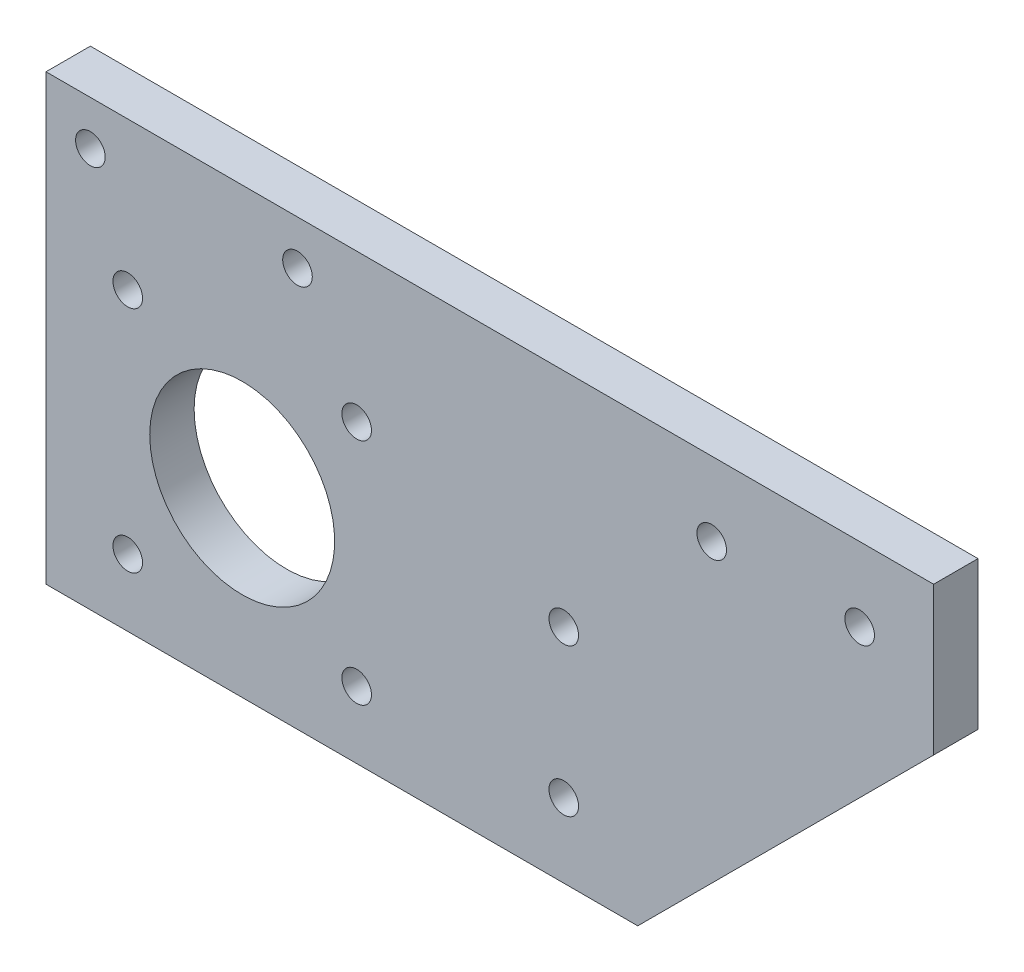
ISO-10303-21;
HEADER;
FILE_DESCRIPTION(('STEP AP214'),'2;1');
FILE_NAME('part.step','',(''),(''),'','','');
FILE_SCHEMA(('AUTOMOTIVE_DESIGN { 1 0 10303 214 1 1 1 1 }'));
ENDSEC;
DATA;
#1=APPLICATION_CONTEXT('core data for automotive mechanical design processes');
#2=APPLICATION_PROTOCOL_DEFINITION('international standard','automotive_design',2000,#1);
#3=PRODUCT_CONTEXT('',#1,'mechanical');
#4=PRODUCT('Part','Part','',(#3));
#5=PRODUCT_RELATED_PRODUCT_CATEGORY('part','',(#4));
#6=PRODUCT_DEFINITION_FORMATION('','',#4);
#7=PRODUCT_DEFINITION_CONTEXT('part definition',#1,'design');
#8=PRODUCT_DEFINITION('design','',#6,#7);
#9=PRODUCT_DEFINITION_SHAPE('','',#8);
#10=(LENGTH_UNIT() NAMED_UNIT(*) SI_UNIT(.MILLI.,.METRE.));
#11=(NAMED_UNIT(*) PLANE_ANGLE_UNIT() SI_UNIT($,.RADIAN.));
#12=(NAMED_UNIT(*) SI_UNIT($,.STERADIAN.) SOLID_ANGLE_UNIT());
#13=UNCERTAINTY_MEASURE_WITH_UNIT(LENGTH_MEASURE(1.E-05),#10,'distance_accuracy_value','');
#14=(GEOMETRIC_REPRESENTATION_CONTEXT(3) GLOBAL_UNCERTAINTY_ASSIGNED_CONTEXT((#13)) GLOBAL_UNIT_ASSIGNED_CONTEXT((#10,
#11,#12)) REPRESENTATION_CONTEXT('',''));
#15=CARTESIAN_POINT('',(0.,0.,0.));
#16=DIRECTION('',(0.,0.,1.));
#17=DIRECTION('',(1.,0.,0.));
#18=AXIS2_PLACEMENT_3D('',#15,#16,#17);
#19=CARTESIAN_POINT('',(0.,0.,6.));
#20=DIRECTION('',(0.,0.,-1.));
#21=DIRECTION('',(-1.,0.,0.));
#22=AXIS2_PLACEMENT_3D('',#19,#20,#21);
#23=PLANE('',#22);
#24=CARTESIAN_POINT('',(-17.9999999999997,-50.95,6.));
#25=DIRECTION('',(0.,0.,-1.));
#26=DIRECTION('',(-1.,0.,0.));
#27=AXIS2_PLACEMENT_3D('',#24,#25,#26);
#28=CIRCLE('',#27,2.00000000000348);
#29=CARTESIAN_POINT('',(-20.0000000000032,-50.95,6.));
#30=VERTEX_POINT('',#29);
#31=EDGE_CURVE('E195',#30,#30,#28,.T.);
#32=ORIENTED_EDGE('',*,*,#31,.T.);
#33=EDGE_LOOP('',(#32));
#34=FACE_BOUND('',#33,.T.);
#35=CARTESIAN_POINT('',(-48.9499999999997,-20.,6.));
#36=DIRECTION('',(0.,0.,-1.));
#37=DIRECTION('',(-1.,0.,0.));
#38=AXIS2_PLACEMENT_3D('',#35,#36,#37);
#39=CIRCLE('',#38,2.00000000000348);
#40=CARTESIAN_POINT('',(-50.9500000000032,-20.,6.));
#41=VERTEX_POINT('',#40);
#42=EDGE_CURVE('E202',#41,#41,#39,.T.);
#43=ORIENTED_EDGE('',*,*,#42,.T.);
#44=EDGE_LOOP('',(#43));
#45=FACE_BOUND('',#44,.T.);
#46=CARTESIAN_POINT('',(-48.9499999999997,-50.95,6.));
#47=DIRECTION('',(0.,0.,-1.));
#48=DIRECTION('',(-1.,0.,0.));
#49=AXIS2_PLACEMENT_3D('',#46,#47,#48);
#50=CIRCLE('',#49,2.00000000000348);
#51=CARTESIAN_POINT('',(-50.9500000000032,-50.95,6.));
#52=VERTEX_POINT('',#51);
#53=EDGE_CURVE('E206',#52,#52,#50,.T.);
#54=ORIENTED_EDGE('',*,*,#53,.T.);
#55=EDGE_LOOP('',(#54));
#56=FACE_BOUND('',#55,.T.);
#57=CARTESIAN_POINT('',(-33.4749999999997,-35.475,6.));
#58=DIRECTION('',(0.,0.,-1.));
#59=DIRECTION('',(-1.,0.,0.));
#60=AXIS2_PLACEMENT_3D('',#57,#58,#59);
#61=CIRCLE('',#60,12.5000000000035);
#62=CARTESIAN_POINT('',(-45.9750000000032,-35.475,6.));
#63=VERTEX_POINT('',#62);
#64=EDGE_CURVE('E210',#63,#63,#61,.T.);
#65=ORIENTED_EDGE('',*,*,#64,.T.);
#66=EDGE_LOOP('',(#65));
#67=FACE_BOUND('',#66,.T.);
#68=CARTESIAN_POINT('',(-17.9999999999997,-20.,6.));
#69=DIRECTION('',(0.,0.,-1.));
#70=DIRECTION('',(-1.,0.,0.));
#71=AXIS2_PLACEMENT_3D('',#68,#69,#70);
#72=CIRCLE('',#71,2.00000000000348);
#73=CARTESIAN_POINT('',(-20.0000000000032,-20.,6.));
#74=VERTEX_POINT('',#73);
#75=EDGE_CURVE('E214',#74,#74,#72,.T.);
#76=ORIENTED_EDGE('',*,*,#75,.T.);
#77=EDGE_LOOP('',(#76));
#78=FACE_BOUND('',#77,.T.);
#79=DIRECTION('',(-1.,0.,0.));
#80=VECTOR('',#79,1.);
#81=CARTESIAN_POINT('',(-60.,0.,6.));
#82=LINE('',#81,#80);
#83=CARTESIAN_POINT('',(60.,0.,6.));
#84=VERTEX_POINT('',#83);
#85=CARTESIAN_POINT('',(-60.,0.,6.));
#86=VERTEX_POINT('',#85);
#87=EDGE_CURVE('E57',#84,#86,#82,.T.);
#88=ORIENTED_EDGE('',*,*,#87,.T.);
#89=DIRECTION('',(0.,-1.,0.));
#90=VECTOR('',#89,1.);
#91=CARTESIAN_POINT('',(-60.,-60.,6.));
#92=LINE('',#91,#90);
#93=CARTESIAN_POINT('',(-60.,-60.,6.));
#94=VERTEX_POINT('',#93);
#95=EDGE_CURVE('E92',#86,#94,#92,.T.);
#96=ORIENTED_EDGE('',*,*,#95,.T.);
#97=DIRECTION('',(1.,0.,0.));
#98=VECTOR('',#97,1.);
#99=CARTESIAN_POINT('',(-60.,-60.,6.));
#100=LINE('',#99,#98);
#101=CARTESIAN_POINT('',(20.,-60.,6.));
#102=VERTEX_POINT('',#101);
#103=EDGE_CURVE('E97',#94,#102,#100,.T.);
#104=ORIENTED_EDGE('',*,*,#103,.T.);
#105=DIRECTION('',(0.707106781186548,0.707106781186548,0.));
#106=VECTOR('',#105,1.);
#107=CARTESIAN_POINT('',(20.,-60.,6.));
#108=LINE('',#107,#106);
#109=CARTESIAN_POINT('',(60.,-20.,6.));
#110=VERTEX_POINT('',#109);
#111=EDGE_CURVE('E101',#102,#110,#108,.T.);
#112=ORIENTED_EDGE('',*,*,#111,.T.);
#113=DIRECTION('',(0.,1.,0.));
#114=VECTOR('',#113,1.);
#115=CARTESIAN_POINT('',(60.,0.,6.));
#116=LINE('',#115,#114);
#117=EDGE_CURVE('E115',#110,#84,#116,.T.);
#118=ORIENTED_EDGE('',*,*,#117,.T.);
#119=EDGE_LOOP('',(#88,#96,#104,#112,#118));
#120=FACE_BOUND('',#119,.T.);
#121=CARTESIAN_POINT('',(50.,-10.,6.));
#122=DIRECTION('',(0.,0.,1.));
#123=DIRECTION('',(1.,0.,0.));
#124=AXIS2_PLACEMENT_3D('',#121,#122,#123);
#125=CIRCLE('',#124,2.);
#126=CARTESIAN_POINT('',(52.,-10.,6.));
#127=VERTEX_POINT('',#126);
#128=EDGE_CURVE('E126',#127,#127,#125,.T.);
#129=ORIENTED_EDGE('',*,*,#128,.F.);
#130=EDGE_LOOP('',(#129));
#131=FACE_BOUND('',#130,.T.);
#132=CARTESIAN_POINT('',(30.,-10.,6.));
#133=DIRECTION('',(0.,0.,1.));
#134=DIRECTION('',(1.,0.,0.));
#135=AXIS2_PLACEMENT_3D('',#132,#133,#134);
#136=CIRCLE('',#135,2.);
#137=CARTESIAN_POINT('',(32.,-10.,6.));
#138=VERTEX_POINT('',#137);
#139=EDGE_CURVE('E155',#138,#138,#136,.T.);
#140=ORIENTED_EDGE('',*,*,#139,.F.);
#141=EDGE_LOOP('',(#140));
#142=FACE_BOUND('',#141,.T.);
#143=CARTESIAN_POINT('',(10.,-50.,6.));
#144=DIRECTION('',(0.,0.,1.));
#145=DIRECTION('',(1.,0.,0.));
#146=AXIS2_PLACEMENT_3D('',#143,#144,#145);
#147=CIRCLE('',#146,2.);
#148=CARTESIAN_POINT('',(12.,-50.,6.));
#149=VERTEX_POINT('',#148);
#150=EDGE_CURVE('E163',#149,#149,#147,.T.);
#151=ORIENTED_EDGE('',*,*,#150,.F.);
#152=EDGE_LOOP('',(#151));
#153=FACE_BOUND('',#152,.T.);
#154=CARTESIAN_POINT('',(10.,-30.,6.));
#155=DIRECTION('',(0.,0.,1.));
#156=DIRECTION('',(1.,0.,0.));
#157=AXIS2_PLACEMENT_3D('',#154,#155,#156);
#158=CIRCLE('',#157,2.);
#159=CARTESIAN_POINT('',(12.,-30.,6.));
#160=VERTEX_POINT('',#159);
#161=EDGE_CURVE('E171',#160,#160,#158,.T.);
#162=ORIENTED_EDGE('',*,*,#161,.F.);
#163=EDGE_LOOP('',(#162));
#164=FACE_BOUND('',#163,.T.);
#165=CARTESIAN_POINT('',(-54.,-6.,6.));
#166=DIRECTION('',(0.,0.,1.));
#167=DIRECTION('',(1.,0.,0.));
#168=AXIS2_PLACEMENT_3D('',#165,#166,#167);
#169=CIRCLE('',#168,2.);
#170=CARTESIAN_POINT('',(-52.,-6.,6.));
#171=VERTEX_POINT('',#170);
#172=EDGE_CURVE('E179',#171,#171,#169,.T.);
#173=ORIENTED_EDGE('',*,*,#172,.F.);
#174=EDGE_LOOP('',(#173));
#175=FACE_BOUND('',#174,.T.);
#176=CARTESIAN_POINT('',(-26.,-6.,6.));
#177=DIRECTION('',(0.,0.,1.));
#178=DIRECTION('',(1.,0.,0.));
#179=AXIS2_PLACEMENT_3D('',#176,#177,#178);
#180=CIRCLE('',#179,2.);
#181=CARTESIAN_POINT('',(-24.,-6.,6.));
#182=VERTEX_POINT('',#181);
#183=EDGE_CURVE('E187',#182,#182,#180,.T.);
#184=ORIENTED_EDGE('',*,*,#183,.F.);
#185=EDGE_LOOP('',(#184));
#186=FACE_BOUND('',#185,.T.);
#187=ADVANCED_FACE('F39',(#34,#45,#56,#67,#78,#120,#131,#142,#153,#164,#175,#186),#23,.F.);
#188=CARTESIAN_POINT('',(0.,0.,0.));
#189=DIRECTION('',(0.,0.,-1.));
#190=DIRECTION('',(-1.,0.,0.));
#191=AXIS2_PLACEMENT_3D('',#188,#189,#190);
#192=PLANE('',#191);
#193=CARTESIAN_POINT('',(-17.9999999999997,-50.95,0.));
#194=DIRECTION('',(0.,0.,-1.));
#195=DIRECTION('',(-1.,0.,0.));
#196=AXIS2_PLACEMENT_3D('',#193,#194,#195);
#197=CIRCLE('',#196,2.00000000000348);
#198=CARTESIAN_POINT('',(-20.0000000000032,-50.95,0.));
#199=VERTEX_POINT('',#198);
#200=EDGE_CURVE('E222',#199,#199,#197,.T.);
#201=ORIENTED_EDGE('',*,*,#200,.F.);
#202=EDGE_LOOP('',(#201));
#203=FACE_BOUND('',#202,.T.);
#204=CARTESIAN_POINT('',(-48.9499999999997,-20.,0.));
#205=DIRECTION('',(0.,0.,-1.));
#206=DIRECTION('',(1.,0.,0.));
#207=AXIS2_PLACEMENT_3D('',#204,#205,#206);
#208=CIRCLE('',#207,2.00000000000348);
#209=CARTESIAN_POINT('',(-46.9499999999962,-20.,0.));
#210=VERTEX_POINT('',#209);
#211=EDGE_CURVE('E223',#210,#210,#208,.T.);
#212=ORIENTED_EDGE('',*,*,#211,.F.);
#213=EDGE_LOOP('',(#212));
#214=FACE_BOUND('',#213,.T.);
#215=CARTESIAN_POINT('',(-48.9499999999997,-50.95,0.));
#216=DIRECTION('',(0.,0.,-1.));
#217=DIRECTION('',(1.,0.,0.));
#218=AXIS2_PLACEMENT_3D('',#215,#216,#217);
#219=CIRCLE('',#218,2.00000000000348);
#220=CARTESIAN_POINT('',(-46.9499999999962,-50.95,0.));
#221=VERTEX_POINT('',#220);
#222=EDGE_CURVE('E227',#221,#221,#219,.T.);
#223=ORIENTED_EDGE('',*,*,#222,.F.);
#224=EDGE_LOOP('',(#223));
#225=FACE_BOUND('',#224,.T.);
#226=CARTESIAN_POINT('',(-33.4749999999997,-35.475,0.));
#227=DIRECTION('',(0.,0.,-1.));
#228=DIRECTION('',(-1.,0.,0.));
#229=AXIS2_PLACEMENT_3D('',#226,#227,#228);
#230=CIRCLE('',#229,12.5000000000035);
#231=CARTESIAN_POINT('',(-45.9750000000032,-35.475,0.));
#232=VERTEX_POINT('',#231);
#233=EDGE_CURVE('E231',#232,#232,#230,.T.);
#234=ORIENTED_EDGE('',*,*,#233,.F.);
#235=EDGE_LOOP('',(#234));
#236=FACE_BOUND('',#235,.T.);
#237=CARTESIAN_POINT('',(-17.9999999999997,-20.,0.));
#238=DIRECTION('',(0.,0.,-1.));
#239=DIRECTION('',(-1.,0.,0.));
#240=AXIS2_PLACEMENT_3D('',#237,#238,#239);
#241=CIRCLE('',#240,2.00000000000348);
#242=CARTESIAN_POINT('',(-20.0000000000032,-20.,0.));
#243=VERTEX_POINT('',#242);
#244=EDGE_CURVE('E218',#243,#243,#241,.T.);
#245=ORIENTED_EDGE('',*,*,#244,.F.);
#246=EDGE_LOOP('',(#245));
#247=FACE_BOUND('',#246,.T.);
#248=CARTESIAN_POINT('',(-54.,-6.,0.));
#249=DIRECTION('',(0.,0.,1.));
#250=DIRECTION('',(1.,0.,0.));
#251=AXIS2_PLACEMENT_3D('',#248,#249,#250);
#252=CIRCLE('',#251,2.);
#253=CARTESIAN_POINT('',(-52.,-6.,0.));
#254=VERTEX_POINT('',#253);
#255=EDGE_CURVE('E183',#254,#254,#252,.T.);
#256=ORIENTED_EDGE('',*,*,#255,.T.);
#257=EDGE_LOOP('',(#256));
#258=FACE_BOUND('',#257,.T.);
#259=CARTESIAN_POINT('',(10.,-50.,0.));
#260=DIRECTION('',(0.,0.,1.));
#261=DIRECTION('',(1.,0.,0.));
#262=AXIS2_PLACEMENT_3D('',#259,#260,#261);
#263=CIRCLE('',#262,2.);
#264=CARTESIAN_POINT('',(12.,-50.,0.));
#265=VERTEX_POINT('',#264);
#266=EDGE_CURVE('E167',#265,#265,#263,.T.);
#267=ORIENTED_EDGE('',*,*,#266,.T.);
#268=EDGE_LOOP('',(#267));
#269=FACE_BOUND('',#268,.T.);
#270=CARTESIAN_POINT('',(50.,-10.,0.));
#271=DIRECTION('',(0.,0.,1.));
#272=DIRECTION('',(1.,0.,0.));
#273=AXIS2_PLACEMENT_3D('',#270,#271,#272);
#274=CIRCLE('',#273,2.);
#275=CARTESIAN_POINT('',(52.,-10.,0.));
#276=VERTEX_POINT('',#275);
#277=EDGE_CURVE('E151',#276,#276,#274,.T.);
#278=ORIENTED_EDGE('',*,*,#277,.T.);
#279=EDGE_LOOP('',(#278));
#280=FACE_BOUND('',#279,.T.);
#281=DIRECTION('',(0.,-1.,0.));
#282=VECTOR('',#281,1.);
#283=CARTESIAN_POINT('',(-60.,-60.,0.));
#284=LINE('',#283,#282);
#285=CARTESIAN_POINT('',(-60.,0.,0.));
#286=VERTEX_POINT('',#285);
#287=CARTESIAN_POINT('',(-60.,-60.,0.));
#288=VERTEX_POINT('',#287);
#289=EDGE_CURVE('E122',#286,#288,#284,.T.);
#290=ORIENTED_EDGE('',*,*,#289,.F.);
#291=DIRECTION('',(-1.,0.,0.));
#292=VECTOR('',#291,1.);
#293=CARTESIAN_POINT('',(0.,0.,0.));
#294=LINE('',#293,#292);
#295=CARTESIAN_POINT('',(60.,0.,0.));
#296=VERTEX_POINT('',#295);
#297=EDGE_CURVE('E133',#296,#286,#294,.T.);
#298=ORIENTED_EDGE('',*,*,#297,.F.);
#299=DIRECTION('',(0.,1.,0.));
#300=VECTOR('',#299,1.);
#301=CARTESIAN_POINT('',(60.,0.,0.));
#302=LINE('',#301,#300);
#303=CARTESIAN_POINT('',(60.,-20.,0.));
#304=VERTEX_POINT('',#303);
#305=EDGE_CURVE('E85',#304,#296,#302,.T.);
#306=ORIENTED_EDGE('',*,*,#305,.F.);
#307=DIRECTION('',(0.707106781186548,0.707106781186548,0.));
#308=VECTOR('',#307,1.);
#309=CARTESIAN_POINT('',(20.,-60.,0.));
#310=LINE('',#309,#308);
#311=CARTESIAN_POINT('',(20.,-60.,0.));
#312=VERTEX_POINT('',#311);
#313=EDGE_CURVE('E78',#312,#304,#310,.T.);
#314=ORIENTED_EDGE('',*,*,#313,.F.);
#315=DIRECTION('',(1.,0.,0.));
#316=VECTOR('',#315,1.);
#317=CARTESIAN_POINT('',(0.,-60.,0.));
#318=LINE('',#317,#316);
#319=EDGE_CURVE('E108',#288,#312,#318,.T.);
#320=ORIENTED_EDGE('',*,*,#319,.F.);
#321=EDGE_LOOP('',(#290,#298,#306,#314,#320));
#322=FACE_BOUND('',#321,.T.);
#323=CARTESIAN_POINT('',(30.,-10.,0.));
#324=DIRECTION('',(0.,0.,1.));
#325=DIRECTION('',(1.,0.,0.));
#326=AXIS2_PLACEMENT_3D('',#323,#324,#325);
#327=CIRCLE('',#326,2.);
#328=CARTESIAN_POINT('',(32.,-10.,0.));
#329=VERTEX_POINT('',#328);
#330=EDGE_CURVE('E159',#329,#329,#327,.T.);
#331=ORIENTED_EDGE('',*,*,#330,.T.);
#332=EDGE_LOOP('',(#331));
#333=FACE_BOUND('',#332,.T.);
#334=CARTESIAN_POINT('',(10.,-30.,0.));
#335=DIRECTION('',(0.,0.,1.));
#336=DIRECTION('',(1.,0.,0.));
#337=AXIS2_PLACEMENT_3D('',#334,#335,#336);
#338=CIRCLE('',#337,2.);
#339=CARTESIAN_POINT('',(12.,-30.,0.));
#340=VERTEX_POINT('',#339);
#341=EDGE_CURVE('E175',#340,#340,#338,.T.);
#342=ORIENTED_EDGE('',*,*,#341,.T.);
#343=EDGE_LOOP('',(#342));
#344=FACE_BOUND('',#343,.T.);
#345=CARTESIAN_POINT('',(-26.,-6.,0.));
#346=DIRECTION('',(0.,0.,1.));
#347=DIRECTION('',(1.,0.,0.));
#348=AXIS2_PLACEMENT_3D('',#345,#346,#347);
#349=CIRCLE('',#348,2.);
#350=CARTESIAN_POINT('',(-24.,-6.,0.));
#351=VERTEX_POINT('',#350);
#352=EDGE_CURVE('E191',#351,#351,#349,.T.);
#353=ORIENTED_EDGE('',*,*,#352,.T.);
#354=EDGE_LOOP('',(#353));
#355=FACE_BOUND('',#354,.T.);
#356=ADVANCED_FACE('F143',(#203,#214,#225,#236,#247,#258,#269,#280,#322,#333,#344,#355),#192,.T.);
#357=CARTESIAN_POINT('',(-60.,-60.,6.));
#358=DIRECTION('',(1.,0.,0.));
#359=DIRECTION('',(0.,0.,-1.));
#360=AXIS2_PLACEMENT_3D('',#357,#358,#359);
#361=PLANE('',#360);
#362=ORIENTED_EDGE('',*,*,#289,.T.);
#363=DIRECTION('',(0.,0.,-1.));
#364=VECTOR('',#363,1.);
#365=CARTESIAN_POINT('',(-60.,-60.,6.));
#366=LINE('',#365,#364);
#367=EDGE_CURVE('E49',#94,#288,#366,.T.);
#368=ORIENTED_EDGE('',*,*,#367,.F.);
#369=ORIENTED_EDGE('',*,*,#95,.F.);
#370=DIRECTION('',(0.,0.,-1.));
#371=VECTOR('',#370,1.);
#372=CARTESIAN_POINT('',(-60.,0.,6.));
#373=LINE('',#372,#371);
#374=EDGE_CURVE('E11',#86,#286,#373,.T.);
#375=ORIENTED_EDGE('',*,*,#374,.T.);
#376=EDGE_LOOP('',(#362,#368,#369,#375));
#377=FACE_BOUND('',#376,.T.);
#378=ADVANCED_FACE('F41',(#377),#361,.F.);
#379=CARTESIAN_POINT('',(0.,-60.,6.));
#380=DIRECTION('',(0.,1.,0.));
#381=DIRECTION('',(0.,0.,1.));
#382=AXIS2_PLACEMENT_3D('',#379,#380,#381);
#383=PLANE('',#382);
#384=ORIENTED_EDGE('',*,*,#319,.T.);
#385=DIRECTION('',(0.,0.,-1.));
#386=VECTOR('',#385,1.);
#387=CARTESIAN_POINT('',(20.,-60.,6.));
#388=LINE('',#387,#386);
#389=EDGE_CURVE('E106',#102,#312,#388,.T.);
#390=ORIENTED_EDGE('',*,*,#389,.F.);
#391=ORIENTED_EDGE('',*,*,#103,.F.);
#392=ORIENTED_EDGE('',*,*,#367,.T.);
#393=EDGE_LOOP('',(#384,#390,#391,#392));
#394=FACE_BOUND('',#393,.T.);
#395=ADVANCED_FACE('F107',(#394),#383,.F.);
#396=CARTESIAN_POINT('',(20.,-60.,6.));
#397=DIRECTION('',(-0.707106781186547,0.707106781186547,0.));
#398=DIRECTION('',(-0.707106781186548,-0.707106781186548,0.));
#399=AXIS2_PLACEMENT_3D('',#396,#397,#398);
#400=PLANE('',#399);
#401=ORIENTED_EDGE('',*,*,#313,.T.);
#402=DIRECTION('',(0.,0.,-1.));
#403=VECTOR('',#402,1.);
#404=CARTESIAN_POINT('',(60.,-20.,6.));
#405=LINE('',#404,#403);
#406=EDGE_CURVE('E110',#110,#304,#405,.T.);
#407=ORIENTED_EDGE('',*,*,#406,.F.);
#408=ORIENTED_EDGE('',*,*,#111,.F.);
#409=ORIENTED_EDGE('',*,*,#389,.T.);
#410=EDGE_LOOP('',(#401,#407,#408,#409));
#411=FACE_BOUND('',#410,.T.);
#412=ADVANCED_FACE('F112',(#411),#400,.F.);
#413=CARTESIAN_POINT('',(60.,0.,6.));
#414=DIRECTION('',(-1.,0.,0.));
#415=DIRECTION('',(0.,0.,1.));
#416=AXIS2_PLACEMENT_3D('',#413,#414,#415);
#417=PLANE('',#416);
#418=ORIENTED_EDGE('',*,*,#305,.T.);
#419=DIRECTION('',(0.,0.,-1.));
#420=VECTOR('',#419,1.);
#421=CARTESIAN_POINT('',(60.,0.,6.));
#422=LINE('',#421,#420);
#423=EDGE_CURVE('E118',#84,#296,#422,.T.);
#424=ORIENTED_EDGE('',*,*,#423,.F.);
#425=ORIENTED_EDGE('',*,*,#117,.F.);
#426=ORIENTED_EDGE('',*,*,#406,.T.);
#427=EDGE_LOOP('',(#418,#424,#425,#426));
#428=FACE_BOUND('',#427,.T.);
#429=ADVANCED_FACE('F146',(#428),#417,.F.);
#430=CARTESIAN_POINT('',(0.,0.,6.));
#431=DIRECTION('',(0.,-1.,0.));
#432=DIRECTION('',(0.,0.,-1.));
#433=AXIS2_PLACEMENT_3D('',#430,#431,#432);
#434=PLANE('',#433);
#435=ORIENTED_EDGE('',*,*,#297,.T.);
#436=ORIENTED_EDGE('',*,*,#374,.F.);
#437=ORIENTED_EDGE('',*,*,#87,.F.);
#438=ORIENTED_EDGE('',*,*,#423,.T.);
#439=EDGE_LOOP('',(#435,#436,#437,#438));
#440=FACE_BOUND('',#439,.T.);
#441=ADVANCED_FACE('F145',(#440),#434,.F.);
#442=CARTESIAN_POINT('',(50.,-10.,6.));
#443=DIRECTION('',(0.,0.,-1.));
#444=DIRECTION('',(-1.,0.,0.));
#445=AXIS2_PLACEMENT_3D('',#442,#443,#444);
#446=CYLINDRICAL_SURFACE('',#445,2.);
#447=ORIENTED_EDGE('',*,*,#128,.T.);
#448=EDGE_LOOP('',(#447));
#449=FACE_BOUND('',#448,.T.);
#450=ORIENTED_EDGE('',*,*,#277,.F.);
#451=EDGE_LOOP('',(#450));
#452=FACE_BOUND('',#451,.T.);
#453=ADVANCED_FACE('F256',(#449,#452),#446,.F.);
#454=CARTESIAN_POINT('',(30.,-10.,6.));
#455=DIRECTION('',(0.,0.,-1.));
#456=DIRECTION('',(-1.,0.,0.));
#457=AXIS2_PLACEMENT_3D('',#454,#455,#456);
#458=CYLINDRICAL_SURFACE('',#457,2.);
#459=ORIENTED_EDGE('',*,*,#139,.T.);
#460=EDGE_LOOP('',(#459));
#461=FACE_BOUND('',#460,.T.);
#462=ORIENTED_EDGE('',*,*,#330,.F.);
#463=EDGE_LOOP('',(#462));
#464=FACE_BOUND('',#463,.T.);
#465=ADVANCED_FACE('F258',(#461,#464),#458,.F.);
#466=CARTESIAN_POINT('',(10.,-50.,6.));
#467=DIRECTION('',(0.,0.,-1.));
#468=DIRECTION('',(-1.,0.,0.));
#469=AXIS2_PLACEMENT_3D('',#466,#467,#468);
#470=CYLINDRICAL_SURFACE('',#469,2.);
#471=ORIENTED_EDGE('',*,*,#150,.T.);
#472=EDGE_LOOP('',(#471));
#473=FACE_BOUND('',#472,.T.);
#474=ORIENTED_EDGE('',*,*,#266,.F.);
#475=EDGE_LOOP('',(#474));
#476=FACE_BOUND('',#475,.T.);
#477=ADVANCED_FACE('F265',(#473,#476),#470,.F.);
#478=CARTESIAN_POINT('',(10.,-30.,6.));
#479=DIRECTION('',(0.,0.,-1.));
#480=DIRECTION('',(-1.,0.,0.));
#481=AXIS2_PLACEMENT_3D('',#478,#479,#480);
#482=CYLINDRICAL_SURFACE('',#481,2.);
#483=ORIENTED_EDGE('',*,*,#161,.T.);
#484=EDGE_LOOP('',(#483));
#485=FACE_BOUND('',#484,.T.);
#486=ORIENTED_EDGE('',*,*,#341,.F.);
#487=EDGE_LOOP('',(#486));
#488=FACE_BOUND('',#487,.T.);
#489=ADVANCED_FACE('F354',(#485,#488),#482,.F.);
#490=CARTESIAN_POINT('',(-54.,-6.,6.));
#491=DIRECTION('',(0.,0.,-1.));
#492=DIRECTION('',(-1.,0.,0.));
#493=AXIS2_PLACEMENT_3D('',#490,#491,#492);
#494=CYLINDRICAL_SURFACE('',#493,2.);
#495=ORIENTED_EDGE('',*,*,#172,.T.);
#496=EDGE_LOOP('',(#495));
#497=FACE_BOUND('',#496,.T.);
#498=ORIENTED_EDGE('',*,*,#255,.F.);
#499=EDGE_LOOP('',(#498));
#500=FACE_BOUND('',#499,.T.);
#501=ADVANCED_FACE('F350',(#497,#500),#494,.F.);
#502=CARTESIAN_POINT('',(-26.,-6.,6.));
#503=DIRECTION('',(0.,0.,-1.));
#504=DIRECTION('',(-1.,0.,0.));
#505=AXIS2_PLACEMENT_3D('',#502,#503,#504);
#506=CYLINDRICAL_SURFACE('',#505,2.);
#507=ORIENTED_EDGE('',*,*,#183,.T.);
#508=EDGE_LOOP('',(#507));
#509=FACE_BOUND('',#508,.T.);
#510=ORIENTED_EDGE('',*,*,#352,.F.);
#511=EDGE_LOOP('',(#510));
#512=FACE_BOUND('',#511,.T.);
#513=ADVANCED_FACE('F303',(#509,#512),#506,.F.);
#514=CARTESIAN_POINT('',(-17.9999999999997,-20.,10.));
#515=DIRECTION('',(0.,0.,-1.));
#516=DIRECTION('',(-1.,0.,0.));
#517=AXIS2_PLACEMENT_3D('',#514,#515,#516);
#518=CYLINDRICAL_SURFACE('',#517,2.00000000000348);
#519=ORIENTED_EDGE('',*,*,#244,.T.);
#520=EDGE_LOOP('',(#519));
#521=FACE_BOUND('',#520,.T.);
#522=ORIENTED_EDGE('',*,*,#75,.F.);
#523=EDGE_LOOP('',(#522));
#524=FACE_BOUND('',#523,.T.);
#525=ADVANCED_FACE('F297',(#521,#524),#518,.F.);
#526=CARTESIAN_POINT('',(-33.4749999999997,-35.475,10.));
#527=DIRECTION('',(0.,0.,-1.));
#528=DIRECTION('',(-1.,0.,0.));
#529=AXIS2_PLACEMENT_3D('',#526,#527,#528);
#530=CYLINDRICAL_SURFACE('',#529,12.5000000000035);
#531=ORIENTED_EDGE('',*,*,#233,.T.);
#532=EDGE_LOOP('',(#531));
#533=FACE_BOUND('',#532,.T.);
#534=ORIENTED_EDGE('',*,*,#64,.F.);
#535=EDGE_LOOP('',(#534));
#536=FACE_BOUND('',#535,.T.);
#537=ADVANCED_FACE('F302',(#533,#536),#530,.F.);
#538=CARTESIAN_POINT('',(-48.9499999999997,-50.95,10.));
#539=DIRECTION('',(0.,0.,-1.));
#540=DIRECTION('',(-1.,0.,0.));
#541=AXIS2_PLACEMENT_3D('',#538,#539,#540);
#542=CYLINDRICAL_SURFACE('',#541,2.00000000000348);
#543=ORIENTED_EDGE('',*,*,#222,.T.);
#544=EDGE_LOOP('',(#543));
#545=FACE_BOUND('',#544,.T.);
#546=ORIENTED_EDGE('',*,*,#53,.F.);
#547=EDGE_LOOP('',(#546));
#548=FACE_BOUND('',#547,.T.);
#549=ADVANCED_FACE('F239',(#545,#548),#542,.F.);
#550=CARTESIAN_POINT('',(-48.9499999999997,-20.,10.));
#551=DIRECTION('',(0.,0.,-1.));
#552=DIRECTION('',(-1.,0.,0.));
#553=AXIS2_PLACEMENT_3D('',#550,#551,#552);
#554=CYLINDRICAL_SURFACE('',#553,2.00000000000348);
#555=ORIENTED_EDGE('',*,*,#211,.T.);
#556=EDGE_LOOP('',(#555));
#557=FACE_BOUND('',#556,.T.);
#558=ORIENTED_EDGE('',*,*,#42,.F.);
#559=EDGE_LOOP('',(#558));
#560=FACE_BOUND('',#559,.T.);
#561=ADVANCED_FACE('F324',(#557,#560),#554,.F.);
#562=CARTESIAN_POINT('',(-17.9999999999997,-50.95,10.));
#563=DIRECTION('',(0.,0.,-1.));
#564=DIRECTION('',(-1.,0.,0.));
#565=AXIS2_PLACEMENT_3D('',#562,#563,#564);
#566=CYLINDRICAL_SURFACE('',#565,2.00000000000348);
#567=ORIENTED_EDGE('',*,*,#200,.T.);
#568=EDGE_LOOP('',(#567));
#569=FACE_BOUND('',#568,.T.);
#570=ORIENTED_EDGE('',*,*,#31,.F.);
#571=EDGE_LOOP('',(#570));
#572=FACE_BOUND('',#571,.T.);
#573=ADVANCED_FACE('F333',(#569,#572),#566,.F.);
#574=CLOSED_SHELL('',(#187,#356,#378,#395,#412,#429,#441,#453,#465,#477,#489,#501,#513,#525,
#537,#549,#561,#573));
#575=MANIFOLD_SOLID_BREP('B2',#574);
#576=ADVANCED_BREP_SHAPE_REPRESENTATION('',(#18,#575),#14);
#577=SHAPE_DEFINITION_REPRESENTATION(#9,#576);
ENDSEC;
END-ISO-10303-21;
